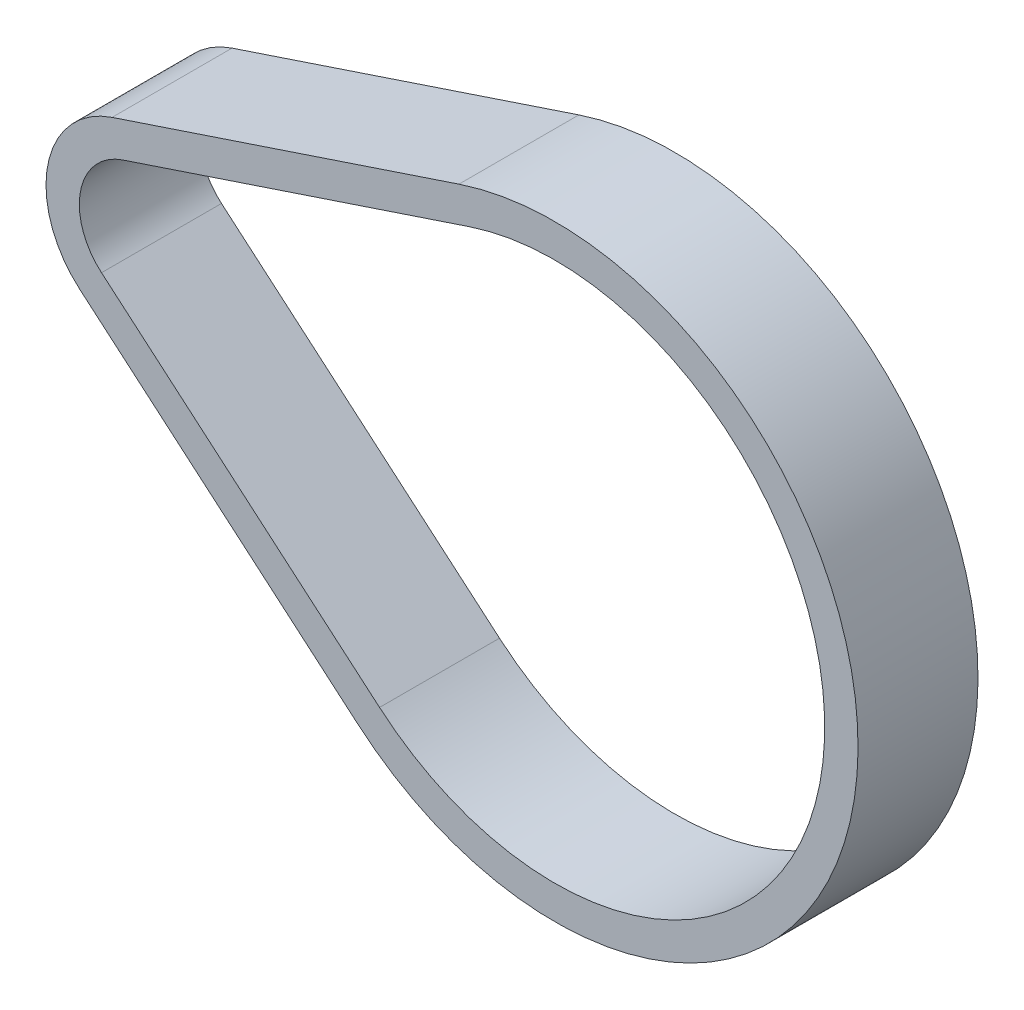
ISO-10303-21;
HEADER;
FILE_DESCRIPTION(('STEP AP214'),'2;1');
FILE_NAME('part.step','',(''),(''),'','','');
FILE_SCHEMA(('AUTOMOTIVE_DESIGN { 1 0 10303 214 1 1 1 1 }'));
ENDSEC;
DATA;
#1=APPLICATION_CONTEXT('core data for automotive mechanical design processes');
#2=APPLICATION_PROTOCOL_DEFINITION('international standard','automotive_design',2000,#1);
#3=PRODUCT_CONTEXT('',#1,'mechanical');
#4=PRODUCT('Part','Part','',(#3));
#5=PRODUCT_RELATED_PRODUCT_CATEGORY('part','',(#4));
#6=PRODUCT_DEFINITION_FORMATION('','',#4);
#7=PRODUCT_DEFINITION_CONTEXT('part definition',#1,'design');
#8=PRODUCT_DEFINITION('design','',#6,#7);
#9=PRODUCT_DEFINITION_SHAPE('','',#8);
#10=(LENGTH_UNIT() NAMED_UNIT(*) SI_UNIT(.MILLI.,.METRE.));
#11=(NAMED_UNIT(*) PLANE_ANGLE_UNIT() SI_UNIT($,.RADIAN.));
#12=(NAMED_UNIT(*) SI_UNIT($,.STERADIAN.) SOLID_ANGLE_UNIT());
#13=UNCERTAINTY_MEASURE_WITH_UNIT(LENGTH_MEASURE(1.E-05),#10,'distance_accuracy_value','');
#14=(GEOMETRIC_REPRESENTATION_CONTEXT(3) GLOBAL_UNCERTAINTY_ASSIGNED_CONTEXT((#13)) GLOBAL_UNIT_ASSIGNED_CONTEXT((#10,
#11,#12)) REPRESENTATION_CONTEXT('',''));
#15=CARTESIAN_POINT('',(0.,0.,0.));
#16=DIRECTION('',(0.,0.,1.));
#17=DIRECTION('',(1.,0.,0.));
#18=AXIS2_PLACEMENT_3D('',#15,#16,#17);
#19=CARTESIAN_POINT('',(110.,122.,-8.));
#20=DIRECTION('',(0.,0.,1.));
#21=DIRECTION('',(1.,0.,0.));
#22=AXIS2_PLACEMENT_3D('',#19,#20,#21);
#23=CYLINDRICAL_SURFACE('',#22,29.);
#24=DIRECTION('',(0.,0.,1.));
#25=VECTOR('',#24,1.);
#26=CARTESIAN_POINT('',(91.1650951390003,99.9490054900671,-8.));
#27=LINE('',#26,#25);
#28=CARTESIAN_POINT('',(91.1650951390003,99.9490054900671,-8.));
#29=VERTEX_POINT('',#28);
#30=CARTESIAN_POINT('',(91.1650951390003,99.9490054900671,28.));
#31=VERTEX_POINT('',#30);
#32=EDGE_CURVE('E89',#29,#31,#27,.T.);
#33=ORIENTED_EDGE('',*,*,#32,.T.);
#34=CARTESIAN_POINT('',(110.,122.,28.));
#35=DIRECTION('',(0.,0.,1.));
#36=DIRECTION('',(1.,0.,0.));
#37=AXIS2_PLACEMENT_3D('',#34,#35,#36);
#38=CIRCLE('',#37,29.);
#39=CARTESIAN_POINT('',(100.830770089273,149.512274039858,28.));
#40=VERTEX_POINT('',#39);
#41=EDGE_CURVE('E181',#40,#31,#38,.T.);
#42=ORIENTED_EDGE('',*,*,#41,.F.);
#43=DIRECTION('',(0.,0.,1.));
#44=VECTOR('',#43,1.);
#45=CARTESIAN_POINT('',(100.830770089273,149.512274039858,-8.));
#46=LINE('',#45,#44);
#47=CARTESIAN_POINT('',(100.830770089273,149.512274039858,-8.));
#48=VERTEX_POINT('',#47);
#49=EDGE_CURVE('E12',#48,#40,#46,.T.);
#50=ORIENTED_EDGE('',*,*,#49,.F.);
#51=CARTESIAN_POINT('',(110.,122.,-8.));
#52=DIRECTION('',(0.,0.,1.));
#53=DIRECTION('',(1.,0.,0.));
#54=AXIS2_PLACEMENT_3D('',#51,#52,#53);
#55=CIRCLE('',#54,29.);
#56=EDGE_CURVE('E201',#48,#29,#55,.T.);
#57=ORIENTED_EDGE('',*,*,#56,.T.);
#58=EDGE_LOOP('',(#33,#42,#50,#57));
#59=FACE_BOUND('',#58,.T.);
#60=ADVANCED_FACE('F86',(#59),#23,.T.);
#61=CARTESIAN_POINT('',(100.830770089273,149.512274039858,-8.));
#62=DIRECTION('',(-0.316180341749215,0.948699104822678,0.));
#63=DIRECTION('',(-0.948699104822678,-0.316180341749215,0.));
#64=AXIS2_PLACEMENT_3D('',#61,#62,#63);
#65=PLANE('',#64);
#66=ORIENTED_EDGE('',*,*,#49,.T.);
#67=DIRECTION('',(-0.948699104822677,-0.316180341749215,0.));
#68=VECTOR('',#67,1.);
#69=CARTESIAN_POINT('',(100.830770089273,149.512274039858,28.));
#70=LINE('',#69,#68);
#71=CARTESIAN_POINT('',(204.932503318687,184.207069704616,28.));
#72=VERTEX_POINT('',#71);
#73=EDGE_CURVE('E190',#72,#40,#70,.T.);
#74=ORIENTED_EDGE('',*,*,#73,.F.);
#75=DIRECTION('',(0.,0.,1.));
#76=VECTOR('',#75,1.);
#77=CARTESIAN_POINT('',(204.932503318687,184.207069704616,-8.));
#78=LINE('',#77,#76);
#79=CARTESIAN_POINT('',(204.932503318687,184.207069704616,-8.));
#80=VERTEX_POINT('',#79);
#81=EDGE_CURVE('E94',#80,#72,#78,.T.);
#82=ORIENTED_EDGE('',*,*,#81,.F.);
#83=DIRECTION('',(-0.948699104822677,-0.316180341749215,0.));
#84=VECTOR('',#83,1.);
#85=CARTESIAN_POINT('',(100.830770089273,149.512274039858,-8.));
#86=LINE('',#85,#84);
#87=EDGE_CURVE('E212',#80,#48,#86,.T.);
#88=ORIENTED_EDGE('',*,*,#87,.T.);
#89=EDGE_LOOP('',(#66,#74,#82,#88));
#90=FACE_BOUND('',#89,.T.);
#91=ADVANCED_FACE('F226',(#90),#65,.T.);
#92=CARTESIAN_POINT('',(233.704914417865,97.8754511657522,-8.));
#93=DIRECTION('',(0.,0.,1.));
#94=DIRECTION('',(1.,0.,0.));
#95=AXIS2_PLACEMENT_3D('',#92,#93,#94);
#96=CYLINDRICAL_SURFACE('',#95,91.);
#97=ORIENTED_EDGE('',*,*,#81,.T.);
#98=CARTESIAN_POINT('',(233.704914417865,97.8754511657522,28.));
#99=DIRECTION('',(0.,0.,1.));
#100=DIRECTION('',(1.,0.,0.));
#101=AXIS2_PLACEMENT_3D('',#98,#99,#100);
#102=CIRCLE('',#101,91.);
#103=CARTESIAN_POINT('',(174.602281923004,28.6809511518249,28.));
#104=VERTEX_POINT('',#103);
#105=EDGE_CURVE('E187',#104,#72,#102,.T.);
#106=ORIENTED_EDGE('',*,*,#105,.F.);
#107=DIRECTION('',(0.,0.,1.));
#108=VECTOR('',#107,1.);
#109=CARTESIAN_POINT('',(174.602281923004,28.6809511518249,-8.));
#110=LINE('',#109,#108);
#111=CARTESIAN_POINT('',(174.602281923004,28.6809511518249,-8.));
#112=VERTEX_POINT('',#111);
#113=EDGE_CURVE('E215',#112,#104,#110,.T.);
#114=ORIENTED_EDGE('',*,*,#113,.F.);
#115=CARTESIAN_POINT('',(233.704914417865,97.8754511657522,-8.));
#116=DIRECTION('',(0.,0.,1.));
#117=DIRECTION('',(1.,0.,0.));
#118=AXIS2_PLACEMENT_3D('',#115,#116,#117);
#119=CIRCLE('',#118,91.);
#120=EDGE_CURVE('E209',#112,#80,#119,.T.);
#121=ORIENTED_EDGE('',*,*,#120,.T.);
#122=EDGE_LOOP('',(#97,#106,#114,#121));
#123=FACE_BOUND('',#122,.T.);
#124=ADVANCED_FACE('F232',(#123),#96,.T.);
#125=CARTESIAN_POINT('',(91.1650951390003,99.9490054900671,-8.));
#126=DIRECTION('',(-0.649479477965507,-0.760379121032168,0.));
#127=DIRECTION('',(0.760379121032168,-0.649479477965507,0.));
#128=AXIS2_PLACEMENT_3D('',#125,#126,#127);
#129=PLANE('',#128);
#130=ORIENTED_EDGE('',*,*,#113,.T.);
#131=DIRECTION('',(0.760379121032168,-0.649479477965507,0.));
#132=VECTOR('',#131,1.);
#133=CARTESIAN_POINT('',(91.1650951390003,99.9490054900671,28.));
#134=LINE('',#133,#132);
#135=EDGE_CURVE('E184',#31,#104,#134,.T.);
#136=ORIENTED_EDGE('',*,*,#135,.F.);
#137=ORIENTED_EDGE('',*,*,#32,.F.);
#138=DIRECTION('',(0.760379121032168,-0.649479477965507,0.));
#139=VECTOR('',#138,1.);
#140=CARTESIAN_POINT('',(91.1650951390003,99.9490054900671,-8.));
#141=LINE('',#140,#139);
#142=EDGE_CURVE('E206',#29,#112,#141,.T.);
#143=ORIENTED_EDGE('',*,*,#142,.T.);
#144=EDGE_LOOP('',(#130,#136,#137,#143));
#145=FACE_BOUND('',#144,.T.);
#146=ADVANCED_FACE('F219',(#145),#129,.T.);
#147=CARTESIAN_POINT('',(110.,122.,-8.));
#148=DIRECTION('',(0.,0.,1.));
#149=DIRECTION('',(1.,0.,0.));
#150=AXIS2_PLACEMENT_3D('',#147,#148,#149);
#151=PLANE('',#150);
#152=DIRECTION('',(-0.948699104822677,-0.316180341749215,0.));
#153=VECTOR('',#152,1.);
#154=CARTESIAN_POINT('',(103.992573506765,140.025282991631,-8.));
#155=LINE('',#154,#153);
#156=CARTESIAN_POINT('',(208.094306736179,174.720078656389,-8.));
#157=VERTEX_POINT('',#156);
#158=CARTESIAN_POINT('',(103.992573506765,140.025282991631,-8.));
#159=VERTEX_POINT('',#158);
#160=EDGE_CURVE('E163',#157,#159,#155,.T.);
#161=ORIENTED_EDGE('',*,*,#160,.T.);
#162=CARTESIAN_POINT('',(110.,122.,-8.));
#163=DIRECTION('',(0.,0.,1.));
#164=DIRECTION('',(1.,0.,0.));
#165=AXIS2_PLACEMENT_3D('',#162,#163,#164);
#166=CIRCLE('',#165,19.);
#167=CARTESIAN_POINT('',(97.6598899186554,107.552796700389,-8.));
#168=VERTEX_POINT('',#167);
#169=EDGE_CURVE('E194',#159,#168,#166,.T.);
#170=ORIENTED_EDGE('',*,*,#169,.T.);
#171=DIRECTION('',(0.760379121032168,-0.649479477965507,0.));
#172=VECTOR('',#171,1.);
#173=CARTESIAN_POINT('',(97.6598899186554,107.552796700389,-8.));
#174=LINE('',#173,#172);
#175=CARTESIAN_POINT('',(181.097076702659,36.2847423621466,-8.));
#176=VERTEX_POINT('',#175);
#177=EDGE_CURVE('E158',#168,#176,#174,.T.);
#178=ORIENTED_EDGE('',*,*,#177,.T.);
#179=CARTESIAN_POINT('',(233.704914417865,97.8754511657522,-8.));
#180=DIRECTION('',(0.,0.,1.));
#181=DIRECTION('',(1.,0.,0.));
#182=AXIS2_PLACEMENT_3D('',#179,#180,#181);
#183=CIRCLE('',#182,81.);
#184=EDGE_CURVE('E102',#176,#157,#183,.T.);
#185=ORIENTED_EDGE('',*,*,#184,.T.);
#186=EDGE_LOOP('',(#161,#170,#178,#185));
#187=FACE_BOUND('',#186,.T.);
#188=ORIENTED_EDGE('',*,*,#56,.F.);
#189=ORIENTED_EDGE('',*,*,#87,.F.);
#190=ORIENTED_EDGE('',*,*,#120,.F.);
#191=ORIENTED_EDGE('',*,*,#142,.F.);
#192=EDGE_LOOP('',(#188,#189,#190,#191));
#193=FACE_BOUND('',#192,.T.);
#194=ADVANCED_FACE('F230',(#187,#193),#151,.F.);
#195=CARTESIAN_POINT('',(110.,122.,-8.));
#196=DIRECTION('',(0.,0.,1.));
#197=DIRECTION('',(1.,0.,0.));
#198=AXIS2_PLACEMENT_3D('',#195,#196,#197);
#199=CYLINDRICAL_SURFACE('',#198,19.);
#200=DIRECTION('',(0.,0.,1.));
#201=VECTOR('',#200,1.);
#202=CARTESIAN_POINT('',(103.992573506765,140.025282991631,-8.));
#203=LINE('',#202,#201);
#204=CARTESIAN_POINT('',(103.992573506765,140.025282991631,28.));
#205=VERTEX_POINT('',#204);
#206=EDGE_CURVE('E168',#159,#205,#203,.T.);
#207=ORIENTED_EDGE('',*,*,#206,.T.);
#208=CARTESIAN_POINT('',(110.,122.,28.));
#209=DIRECTION('',(0.,0.,1.));
#210=DIRECTION('',(1.,0.,0.));
#211=AXIS2_PLACEMENT_3D('',#208,#209,#210);
#212=CIRCLE('',#211,19.);
#213=CARTESIAN_POINT('',(97.6598899186554,107.552796700389,28.));
#214=VERTEX_POINT('',#213);
#215=EDGE_CURVE('E166',#205,#214,#212,.T.);
#216=ORIENTED_EDGE('',*,*,#215,.T.);
#217=DIRECTION('',(0.,0.,1.));
#218=VECTOR('',#217,1.);
#219=CARTESIAN_POINT('',(97.6598899186554,107.552796700389,-8.));
#220=LINE('',#219,#218);
#221=EDGE_CURVE('E151',#168,#214,#220,.T.);
#222=ORIENTED_EDGE('',*,*,#221,.F.);
#223=ORIENTED_EDGE('',*,*,#169,.F.);
#224=EDGE_LOOP('',(#207,#216,#222,#223));
#225=FACE_BOUND('',#224,.T.);
#226=ADVANCED_FACE('F167',(#225),#199,.F.);
#227=CARTESIAN_POINT('',(103.992573506765,140.025282991631,-8.));
#228=DIRECTION('',(-0.316180341749215,0.948699104822678,0.));
#229=DIRECTION('',(-0.948699104822678,-0.316180341749215,0.));
#230=AXIS2_PLACEMENT_3D('',#227,#228,#229);
#231=PLANE('',#230);
#232=DIRECTION('',(0.,0.,1.));
#233=VECTOR('',#232,1.);
#234=CARTESIAN_POINT('',(208.094306736179,174.720078656389,-8.));
#235=LINE('',#234,#233);
#236=CARTESIAN_POINT('',(208.094306736179,174.720078656389,28.));
#237=VERTEX_POINT('',#236);
#238=EDGE_CURVE('E202',#157,#237,#235,.T.);
#239=ORIENTED_EDGE('',*,*,#238,.T.);
#240=DIRECTION('',(-0.948699104822677,-0.316180341749215,0.));
#241=VECTOR('',#240,1.);
#242=CARTESIAN_POINT('',(103.992573506765,140.025282991631,28.));
#243=LINE('',#242,#241);
#244=EDGE_CURVE('E177',#237,#205,#243,.T.);
#245=ORIENTED_EDGE('',*,*,#244,.T.);
#246=ORIENTED_EDGE('',*,*,#206,.F.);
#247=ORIENTED_EDGE('',*,*,#160,.F.);
#248=EDGE_LOOP('',(#239,#245,#246,#247));
#249=FACE_BOUND('',#248,.T.);
#250=ADVANCED_FACE('F275',(#249),#231,.F.);
#251=CARTESIAN_POINT('',(233.704914417865,97.8754511657522,-8.));
#252=DIRECTION('',(0.,0.,1.));
#253=DIRECTION('',(1.,0.,0.));
#254=AXIS2_PLACEMENT_3D('',#251,#252,#253);
#255=CYLINDRICAL_SURFACE('',#254,81.);
#256=DIRECTION('',(0.,0.,1.));
#257=VECTOR('',#256,1.);
#258=CARTESIAN_POINT('',(181.097076702659,36.2847423621466,-8.));
#259=LINE('',#258,#257);
#260=CARTESIAN_POINT('',(181.097076702659,36.2847423621466,28.));
#261=VERTEX_POINT('',#260);
#262=EDGE_CURVE('E162',#176,#261,#259,.T.);
#263=ORIENTED_EDGE('',*,*,#262,.T.);
#264=CARTESIAN_POINT('',(233.704914417865,97.8754511657522,28.));
#265=DIRECTION('',(0.,0.,1.));
#266=DIRECTION('',(1.,0.,0.));
#267=AXIS2_PLACEMENT_3D('',#264,#265,#266);
#268=CIRCLE('',#267,81.);
#269=EDGE_CURVE('E175',#261,#237,#268,.T.);
#270=ORIENTED_EDGE('',*,*,#269,.T.);
#271=ORIENTED_EDGE('',*,*,#238,.F.);
#272=ORIENTED_EDGE('',*,*,#184,.F.);
#273=EDGE_LOOP('',(#263,#270,#271,#272));
#274=FACE_BOUND('',#273,.T.);
#275=ADVANCED_FACE('F284',(#274),#255,.F.);
#276=CARTESIAN_POINT('',(97.6598899186554,107.552796700389,-8.));
#277=DIRECTION('',(-0.649479477965507,-0.760379121032168,0.));
#278=DIRECTION('',(0.760379121032168,-0.649479477965507,0.));
#279=AXIS2_PLACEMENT_3D('',#276,#277,#278);
#280=PLANE('',#279);
#281=ORIENTED_EDGE('',*,*,#221,.T.);
#282=DIRECTION('',(0.760379121032168,-0.649479477965507,0.));
#283=VECTOR('',#282,1.);
#284=CARTESIAN_POINT('',(97.6598899186554,107.552796700389,28.));
#285=LINE('',#284,#283);
#286=EDGE_CURVE('E155',#214,#261,#285,.T.);
#287=ORIENTED_EDGE('',*,*,#286,.T.);
#288=ORIENTED_EDGE('',*,*,#262,.F.);
#289=ORIENTED_EDGE('',*,*,#177,.F.);
#290=EDGE_LOOP('',(#281,#287,#288,#289));
#291=FACE_BOUND('',#290,.T.);
#292=ADVANCED_FACE('F153',(#291),#280,.F.);
#293=CARTESIAN_POINT('',(110.,122.,28.));
#294=DIRECTION('',(0.,0.,1.));
#295=DIRECTION('',(1.,0.,0.));
#296=AXIS2_PLACEMENT_3D('',#293,#294,#295);
#297=PLANE('',#296);
#298=ORIENTED_EDGE('',*,*,#41,.T.);
#299=ORIENTED_EDGE('',*,*,#135,.T.);
#300=ORIENTED_EDGE('',*,*,#105,.T.);
#301=ORIENTED_EDGE('',*,*,#73,.T.);
#302=EDGE_LOOP('',(#298,#299,#300,#301));
#303=FACE_BOUND('',#302,.T.);
#304=ORIENTED_EDGE('',*,*,#286,.F.);
#305=ORIENTED_EDGE('',*,*,#215,.F.);
#306=ORIENTED_EDGE('',*,*,#244,.F.);
#307=ORIENTED_EDGE('',*,*,#269,.F.);
#308=EDGE_LOOP('',(#304,#305,#306,#307));
#309=FACE_BOUND('',#308,.T.);
#310=ADVANCED_FACE('F173',(#303,#309),#297,.T.);
#311=CLOSED_SHELL('',(#60,#91,#124,#146,#194,#226,#250,#275,#292,#310));
#312=MANIFOLD_SOLID_BREP('B2',#311);
#313=ADVANCED_BREP_SHAPE_REPRESENTATION('',(#18,#312),#14);
#314=SHAPE_DEFINITION_REPRESENTATION(#9,#313);
ENDSEC;
END-ISO-10303-21;
